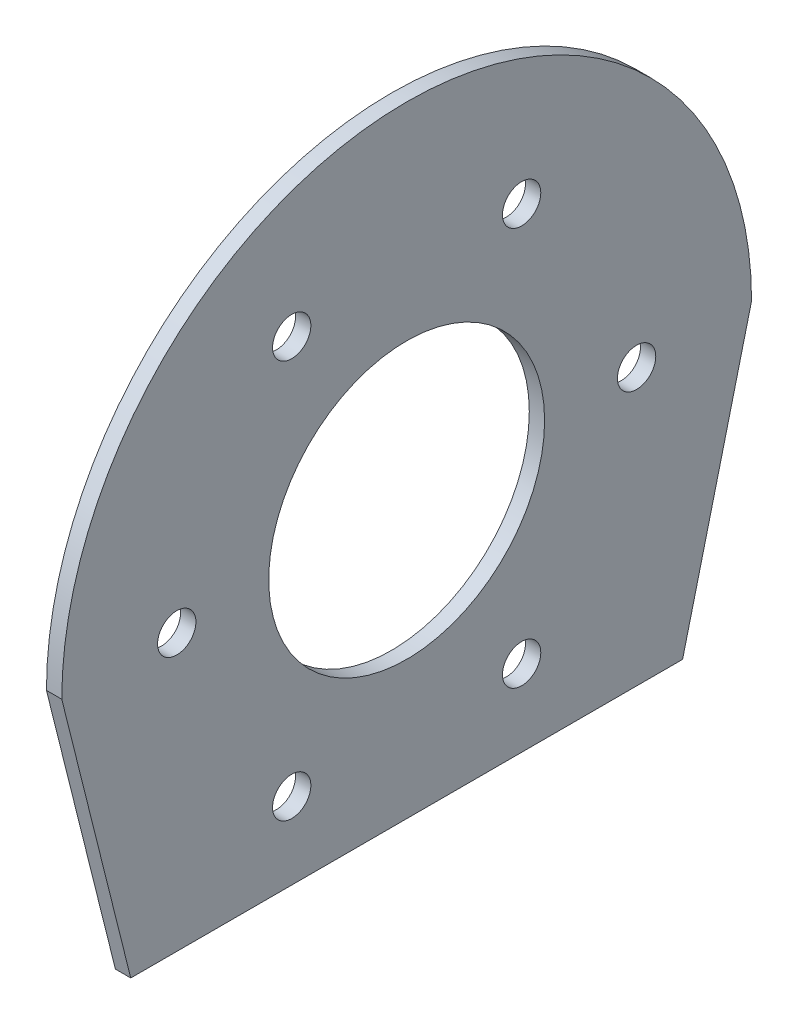
ISO-10303-21;
HEADER;
FILE_DESCRIPTION(('STEP AP214'),'2;1');
FILE_NAME('part.step','',(''),(''),'','','');
FILE_SCHEMA(('AUTOMOTIVE_DESIGN { 1 0 10303 214 1 1 1 1 }'));
ENDSEC;
DATA;
#1=APPLICATION_CONTEXT('core data for automotive mechanical design processes');
#2=APPLICATION_PROTOCOL_DEFINITION('international standard','automotive_design',2000,#1);
#3=PRODUCT_CONTEXT('',#1,'mechanical');
#4=PRODUCT('Part','Part','',(#3));
#5=PRODUCT_RELATED_PRODUCT_CATEGORY('part','',(#4));
#6=PRODUCT_DEFINITION_FORMATION('','',#4);
#7=PRODUCT_DEFINITION_CONTEXT('part definition',#1,'design');
#8=PRODUCT_DEFINITION('design','',#6,#7);
#9=PRODUCT_DEFINITION_SHAPE('','',#8);
#10=(LENGTH_UNIT() NAMED_UNIT(*) SI_UNIT(.MILLI.,.METRE.));
#11=(NAMED_UNIT(*) PLANE_ANGLE_UNIT() SI_UNIT($,.RADIAN.));
#12=(NAMED_UNIT(*) SI_UNIT($,.STERADIAN.) SOLID_ANGLE_UNIT());
#13=UNCERTAINTY_MEASURE_WITH_UNIT(LENGTH_MEASURE(1.E-05),#10,'distance_accuracy_value','');
#14=(GEOMETRIC_REPRESENTATION_CONTEXT(3) GLOBAL_UNCERTAINTY_ASSIGNED_CONTEXT((#13)) GLOBAL_UNIT_ASSIGNED_CONTEXT((#10,
#11,#12)) REPRESENTATION_CONTEXT('',''));
#15=CARTESIAN_POINT('',(0.,0.,0.));
#16=DIRECTION('',(0.,0.,1.));
#17=DIRECTION('',(1.,0.,0.));
#18=AXIS2_PLACEMENT_3D('',#15,#16,#17);
#19=CARTESIAN_POINT('',(0.5,0.,0.));
#20=DIRECTION('',(-1.,0.,0.));
#21=DIRECTION('',(0.,0.,1.));
#22=AXIS2_PLACEMENT_3D('',#19,#20,#21);
#23=PLANE('',#22);
#24=CARTESIAN_POINT('',(0.5,0.,-15.));
#25=DIRECTION('',(1.,0.,0.));
#26=DIRECTION('',(0.,0.,-1.));
#27=AXIS2_PLACEMENT_3D('',#24,#25,#26);
#28=CIRCLE('',#27,1.25);
#29=CARTESIAN_POINT('',(0.5,0.,-16.25));
#30=VERTEX_POINT('',#29);
#31=EDGE_CURVE('E140',#30,#30,#28,.T.);
#32=ORIENTED_EDGE('',*,*,#31,.F.);
#33=EDGE_LOOP('',(#32));
#34=FACE_BOUND('',#33,.T.);
#35=CARTESIAN_POINT('',(0.5,12.9903810567666,-7.49999999999999));
#36=DIRECTION('',(1.,0.,0.));
#37=DIRECTION('',(0.,0.,-1.));
#38=AXIS2_PLACEMENT_3D('',#35,#36,#37);
#39=CIRCLE('',#38,1.25);
#40=CARTESIAN_POINT('',(0.5,12.9903810567666,-8.74999999999999));
#41=VERTEX_POINT('',#40);
#42=EDGE_CURVE('E145',#41,#41,#39,.T.);
#43=ORIENTED_EDGE('',*,*,#42,.F.);
#44=EDGE_LOOP('',(#43));
#45=FACE_BOUND('',#44,.T.);
#46=CARTESIAN_POINT('',(0.5,12.9903810567666,7.50000000000001));
#47=DIRECTION('',(1.,0.,0.));
#48=DIRECTION('',(0.,0.,-1.));
#49=AXIS2_PLACEMENT_3D('',#46,#47,#48);
#50=CIRCLE('',#49,1.25);
#51=CARTESIAN_POINT('',(0.5,12.9903810567666,6.25000000000001));
#52=VERTEX_POINT('',#51);
#53=EDGE_CURVE('E121',#52,#52,#50,.T.);
#54=ORIENTED_EDGE('',*,*,#53,.F.);
#55=EDGE_LOOP('',(#54));
#56=FACE_BOUND('',#55,.T.);
#57=CARTESIAN_POINT('',(0.5,0.,15.));
#58=DIRECTION('',(1.,0.,0.));
#59=DIRECTION('',(0.,0.,-1.));
#60=AXIS2_PLACEMENT_3D('',#57,#58,#59);
#61=CIRCLE('',#60,1.25);
#62=CARTESIAN_POINT('',(0.5,0.,13.75));
#63=VERTEX_POINT('',#62);
#64=EDGE_CURVE('E120',#63,#63,#61,.T.);
#65=ORIENTED_EDGE('',*,*,#64,.F.);
#66=EDGE_LOOP('',(#65));
#67=FACE_BOUND('',#66,.T.);
#68=CARTESIAN_POINT('',(0.5,-12.9903810567666,7.5));
#69=DIRECTION('',(1.,0.,0.));
#70=DIRECTION('',(0.,0.,-1.));
#71=AXIS2_PLACEMENT_3D('',#68,#69,#70);
#72=CIRCLE('',#71,1.25);
#73=CARTESIAN_POINT('',(0.5,-12.9903810567666,6.24999999999999));
#74=VERTEX_POINT('',#73);
#75=EDGE_CURVE('E128',#74,#74,#72,.T.);
#76=ORIENTED_EDGE('',*,*,#75,.F.);
#77=EDGE_LOOP('',(#76));
#78=FACE_BOUND('',#77,.T.);
#79=CARTESIAN_POINT('',(0.5,-12.9903810567666,-7.5));
#80=DIRECTION('',(1.,0.,0.));
#81=DIRECTION('',(0.,0.,-1.));
#82=AXIS2_PLACEMENT_3D('',#79,#80,#81);
#83=CIRCLE('',#82,1.25);
#84=CARTESIAN_POINT('',(0.5,-12.9903810567666,-8.75));
#85=VERTEX_POINT('',#84);
#86=EDGE_CURVE('E134',#85,#85,#83,.T.);
#87=ORIENTED_EDGE('',*,*,#86,.F.);
#88=EDGE_LOOP('',(#87));
#89=FACE_BOUND('',#88,.T.);
#90=CARTESIAN_POINT('',(0.5,0.,0.));
#91=DIRECTION('',(1.,0.,0.));
#92=DIRECTION('',(0.,0.,1.));
#93=AXIS2_PLACEMENT_3D('',#90,#91,#92);
#94=CIRCLE('',#93,22.5);
#95=CARTESIAN_POINT('',(0.5,0.,-22.5));
#96=VERTEX_POINT('',#95);
#97=CARTESIAN_POINT('',(0.5,0.,22.5));
#98=VERTEX_POINT('',#97);
#99=EDGE_CURVE('E84',#96,#98,#94,.T.);
#100=ORIENTED_EDGE('',*,*,#99,.T.);
#101=DIRECTION('',(0.,-0.970142500145332,-0.242535625036333));
#102=VECTOR('',#101,1.);
#103=CARTESIAN_POINT('',(0.5,-18.,18.));
#104=LINE('',#103,#102);
#105=CARTESIAN_POINT('',(0.5,-18.,18.));
#106=VERTEX_POINT('',#105);
#107=EDGE_CURVE('E79',#98,#106,#104,.T.);
#108=ORIENTED_EDGE('',*,*,#107,.T.);
#109=DIRECTION('',(0.,0.,-1.));
#110=VECTOR('',#109,1.);
#111=CARTESIAN_POINT('',(0.5,-18.,18.));
#112=LINE('',#111,#110);
#113=CARTESIAN_POINT('',(0.5,-18.,-18.));
#114=VERTEX_POINT('',#113);
#115=EDGE_CURVE('E82',#106,#114,#112,.T.);
#116=ORIENTED_EDGE('',*,*,#115,.T.);
#117=DIRECTION('',(0.,0.970142500145332,-0.242535625036333));
#118=VECTOR('',#117,1.);
#119=CARTESIAN_POINT('',(0.5,-18.,-18.));
#120=LINE('',#119,#118);
#121=EDGE_CURVE('E49',#114,#96,#120,.T.);
#122=ORIENTED_EDGE('',*,*,#121,.T.);
#123=EDGE_LOOP('',(#100,#108,#116,#122));
#124=FACE_BOUND('',#123,.T.);
#125=CARTESIAN_POINT('',(0.5,0.,0.));
#126=DIRECTION('',(1.,0.,0.));
#127=DIRECTION('',(0.,0.,-1.));
#128=AXIS2_PLACEMENT_3D('',#125,#126,#127);
#129=CIRCLE('',#128,9.);
#130=CARTESIAN_POINT('',(0.5,0.,-9.));
#131=VERTEX_POINT('',#130);
#132=EDGE_CURVE('E99',#131,#131,#129,.T.);
#133=ORIENTED_EDGE('',*,*,#132,.F.);
#134=EDGE_LOOP('',(#133));
#135=FACE_BOUND('',#134,.T.);
#136=ADVANCED_FACE('F32',(#34,#45,#56,#67,#78,#89,#124,#135),#23,.F.);
#137=CARTESIAN_POINT('',(-0.5,0.,0.));
#138=DIRECTION('',(-1.,0.,0.));
#139=DIRECTION('',(0.,0.,1.));
#140=AXIS2_PLACEMENT_3D('',#137,#138,#139);
#141=PLANE('',#140);
#142=CARTESIAN_POINT('',(-0.5,0.,-15.));
#143=DIRECTION('',(-1.,0.,0.));
#144=DIRECTION('',(0.,0.,1.));
#145=AXIS2_PLACEMENT_3D('',#142,#143,#144);
#146=CIRCLE('',#145,1.25);
#147=CARTESIAN_POINT('',(-0.5,0.,-13.75));
#148=VERTEX_POINT('',#147);
#149=EDGE_CURVE('E114',#148,#148,#146,.F.);
#150=ORIENTED_EDGE('',*,*,#149,.T.);
#151=EDGE_LOOP('',(#150));
#152=FACE_BOUND('',#151,.T.);
#153=CARTESIAN_POINT('',(-0.5,12.9903810567666,-7.49999999999999));
#154=DIRECTION('',(-1.,0.,0.));
#155=DIRECTION('',(0.,0.,1.));
#156=AXIS2_PLACEMENT_3D('',#153,#154,#155);
#157=CIRCLE('',#156,1.25);
#158=CARTESIAN_POINT('',(-0.5,12.9903810567666,-6.24999999999999));
#159=VERTEX_POINT('',#158);
#160=EDGE_CURVE('E124',#159,#159,#157,.F.);
#161=ORIENTED_EDGE('',*,*,#160,.T.);
#162=EDGE_LOOP('',(#161));
#163=FACE_BOUND('',#162,.T.);
#164=CARTESIAN_POINT('',(-0.5,12.9903810567666,7.50000000000001));
#165=DIRECTION('',(-1.,0.,0.));
#166=DIRECTION('',(0.,0.,1.));
#167=AXIS2_PLACEMENT_3D('',#164,#165,#166);
#168=CIRCLE('',#167,1.25);
#169=CARTESIAN_POINT('',(-0.5,12.9903810567666,8.75000000000001));
#170=VERTEX_POINT('',#169);
#171=EDGE_CURVE('E117',#170,#170,#168,.F.);
#172=ORIENTED_EDGE('',*,*,#171,.T.);
#173=EDGE_LOOP('',(#172));
#174=FACE_BOUND('',#173,.T.);
#175=CARTESIAN_POINT('',(-0.5,0.,15.));
#176=DIRECTION('',(-1.,0.,0.));
#177=DIRECTION('',(0.,0.,1.));
#178=AXIS2_PLACEMENT_3D('',#175,#176,#177);
#179=CIRCLE('',#178,1.25);
#180=CARTESIAN_POINT('',(-0.5,0.,16.25));
#181=VERTEX_POINT('',#180);
#182=EDGE_CURVE('E125',#181,#181,#179,.F.);
#183=ORIENTED_EDGE('',*,*,#182,.T.);
#184=EDGE_LOOP('',(#183));
#185=FACE_BOUND('',#184,.T.);
#186=CARTESIAN_POINT('',(-0.5,-12.9903810567666,7.5));
#187=DIRECTION('',(-1.,0.,0.));
#188=DIRECTION('',(0.,0.,1.));
#189=AXIS2_PLACEMENT_3D('',#186,#187,#188);
#190=CIRCLE('',#189,1.25);
#191=CARTESIAN_POINT('',(-0.5,-12.9903810567666,8.75));
#192=VERTEX_POINT('',#191);
#193=EDGE_CURVE('E131',#192,#192,#190,.F.);
#194=ORIENTED_EDGE('',*,*,#193,.T.);
#195=EDGE_LOOP('',(#194));
#196=FACE_BOUND('',#195,.T.);
#197=CARTESIAN_POINT('',(-0.5,-12.9903810567666,-7.5));
#198=DIRECTION('',(-1.,0.,0.));
#199=DIRECTION('',(0.,0.,1.));
#200=AXIS2_PLACEMENT_3D('',#197,#198,#199);
#201=CIRCLE('',#200,1.25);
#202=CARTESIAN_POINT('',(-0.5,-12.9903810567666,-6.25));
#203=VERTEX_POINT('',#202);
#204=EDGE_CURVE('E137',#203,#203,#201,.F.);
#205=ORIENTED_EDGE('',*,*,#204,.T.);
#206=EDGE_LOOP('',(#205));
#207=FACE_BOUND('',#206,.T.);
#208=CARTESIAN_POINT('',(-0.5,0.,0.));
#209=DIRECTION('',(1.,0.,0.));
#210=DIRECTION('',(0.,0.,1.));
#211=AXIS2_PLACEMENT_3D('',#208,#209,#210);
#212=CIRCLE('',#211,22.5);
#213=CARTESIAN_POINT('',(-0.5,0.,-22.5));
#214=VERTEX_POINT('',#213);
#215=CARTESIAN_POINT('',(-0.5,0.,22.5));
#216=VERTEX_POINT('',#215);
#217=EDGE_CURVE('E96',#214,#216,#212,.T.);
#218=ORIENTED_EDGE('',*,*,#217,.F.);
#219=DIRECTION('',(0.,0.970142500145332,-0.242535625036333));
#220=VECTOR('',#219,1.);
#221=CARTESIAN_POINT('',(-0.5,-18.,-18.));
#222=LINE('',#221,#220);
#223=CARTESIAN_POINT('',(-0.5,-18.,-18.));
#224=VERTEX_POINT('',#223);
#225=EDGE_CURVE('E72',#224,#214,#222,.T.);
#226=ORIENTED_EDGE('',*,*,#225,.F.);
#227=DIRECTION('',(0.,0.,-1.));
#228=VECTOR('',#227,1.);
#229=CARTESIAN_POINT('',(-0.5,-18.,18.));
#230=LINE('',#229,#228);
#231=CARTESIAN_POINT('',(-0.5,-18.,18.));
#232=VERTEX_POINT('',#231);
#233=EDGE_CURVE('E66',#232,#224,#230,.T.);
#234=ORIENTED_EDGE('',*,*,#233,.F.);
#235=DIRECTION('',(0.,-0.970142500145332,-0.242535625036333));
#236=VECTOR('',#235,1.);
#237=CARTESIAN_POINT('',(-0.5,-18.,18.));
#238=LINE('',#237,#236);
#239=EDGE_CURVE('E88',#216,#232,#238,.T.);
#240=ORIENTED_EDGE('',*,*,#239,.F.);
#241=EDGE_LOOP('',(#218,#226,#234,#240));
#242=FACE_BOUND('',#241,.T.);
#243=CARTESIAN_POINT('',(-0.5,0.,0.));
#244=DIRECTION('',(1.,0.,0.));
#245=DIRECTION('',(0.,0.,-1.));
#246=AXIS2_PLACEMENT_3D('',#243,#244,#245);
#247=CIRCLE('',#246,9.);
#248=CARTESIAN_POINT('',(-0.5,0.,-9.));
#249=VERTEX_POINT('',#248);
#250=EDGE_CURVE('E111',#249,#249,#247,.T.);
#251=ORIENTED_EDGE('',*,*,#250,.T.);
#252=EDGE_LOOP('',(#251));
#253=FACE_BOUND('',#252,.T.);
#254=ADVANCED_FACE('F107',(#152,#163,#174,#185,#196,#207,#242,#253),#141,.T.);
#255=CARTESIAN_POINT('',(0.5,0.,0.));
#256=DIRECTION('',(-1.,0.,0.));
#257=DIRECTION('',(0.,0.,1.));
#258=AXIS2_PLACEMENT_3D('',#255,#256,#257);
#259=CYLINDRICAL_SURFACE('',#258,22.5);
#260=ORIENTED_EDGE('',*,*,#217,.T.);
#261=DIRECTION('',(-1.,0.,0.));
#262=VECTOR('',#261,1.);
#263=CARTESIAN_POINT('',(0.5,0.,22.5));
#264=LINE('',#263,#262);
#265=EDGE_CURVE('E11',#98,#216,#264,.T.);
#266=ORIENTED_EDGE('',*,*,#265,.F.);
#267=ORIENTED_EDGE('',*,*,#99,.F.);
#268=DIRECTION('',(-1.,0.,0.));
#269=VECTOR('',#268,1.);
#270=CARTESIAN_POINT('',(0.5,0.,-22.5));
#271=LINE('',#270,#269);
#272=EDGE_CURVE('E92',#96,#214,#271,.T.);
#273=ORIENTED_EDGE('',*,*,#272,.T.);
#274=EDGE_LOOP('',(#260,#266,#267,#273));
#275=FACE_BOUND('',#274,.T.);
#276=ADVANCED_FACE('F34',(#275),#259,.T.);
#277=CARTESIAN_POINT('',(0.5,-18.,18.));
#278=DIRECTION('',(0.,0.242535625036333,-0.970142500145332));
#279=DIRECTION('',(0.,0.970142500145332,0.242535625036333));
#280=AXIS2_PLACEMENT_3D('',#277,#278,#279);
#281=PLANE('',#280);
#282=ORIENTED_EDGE('',*,*,#239,.T.);
#283=DIRECTION('',(-1.,0.,0.));
#284=VECTOR('',#283,1.);
#285=CARTESIAN_POINT('',(0.5,-18.,18.));
#286=LINE('',#285,#284);
#287=EDGE_CURVE('E41',#106,#232,#286,.T.);
#288=ORIENTED_EDGE('',*,*,#287,.F.);
#289=ORIENTED_EDGE('',*,*,#107,.F.);
#290=ORIENTED_EDGE('',*,*,#265,.T.);
#291=EDGE_LOOP('',(#282,#288,#289,#290));
#292=FACE_BOUND('',#291,.T.);
#293=ADVANCED_FACE('F87',(#292),#281,.F.);
#294=CARTESIAN_POINT('',(0.5,-18.,18.));
#295=DIRECTION('',(0.,1.,0.));
#296=DIRECTION('',(0.,0.,1.));
#297=AXIS2_PLACEMENT_3D('',#294,#295,#296);
#298=PLANE('',#297);
#299=ORIENTED_EDGE('',*,*,#233,.T.);
#300=DIRECTION('',(-1.,0.,0.));
#301=VECTOR('',#300,1.);
#302=CARTESIAN_POINT('',(0.5,-18.,-18.));
#303=LINE('',#302,#301);
#304=EDGE_CURVE('E89',#114,#224,#303,.T.);
#305=ORIENTED_EDGE('',*,*,#304,.F.);
#306=ORIENTED_EDGE('',*,*,#115,.F.);
#307=ORIENTED_EDGE('',*,*,#287,.T.);
#308=EDGE_LOOP('',(#299,#305,#306,#307));
#309=FACE_BOUND('',#308,.T.);
#310=ADVANCED_FACE('F90',(#309),#298,.F.);
#311=CARTESIAN_POINT('',(0.5,-18.,-18.));
#312=DIRECTION('',(0.,0.242535625036333,0.970142500145332));
#313=DIRECTION('',(0.,-0.970142500145332,0.242535625036333));
#314=AXIS2_PLACEMENT_3D('',#311,#312,#313);
#315=PLANE('',#314);
#316=ORIENTED_EDGE('',*,*,#225,.T.);
#317=ORIENTED_EDGE('',*,*,#272,.F.);
#318=ORIENTED_EDGE('',*,*,#121,.F.);
#319=ORIENTED_EDGE('',*,*,#304,.T.);
#320=EDGE_LOOP('',(#316,#317,#318,#319));
#321=FACE_BOUND('',#320,.T.);
#322=ADVANCED_FACE('F104',(#321),#315,.F.);
#323=CARTESIAN_POINT('',(0.5,0.,0.));
#324=DIRECTION('',(-1.,0.,0.));
#325=DIRECTION('',(0.,0.,1.));
#326=AXIS2_PLACEMENT_3D('',#323,#324,#325);
#327=CYLINDRICAL_SURFACE('',#326,9.);
#328=ORIENTED_EDGE('',*,*,#132,.T.);
#329=EDGE_LOOP('',(#328));
#330=FACE_BOUND('',#329,.T.);
#331=ORIENTED_EDGE('',*,*,#250,.F.);
#332=EDGE_LOOP('',(#331));
#333=FACE_BOUND('',#332,.T.);
#334=ADVANCED_FACE('F173',(#330,#333),#327,.F.);
#335=CARTESIAN_POINT('',(-4.03553390593275,-12.9903810567666,-7.5));
#336=DIRECTION('',(1.,0.,0.));
#337=DIRECTION('',(0.,0.,-1.));
#338=AXIS2_PLACEMENT_3D('',#335,#336,#337);
#339=CYLINDRICAL_SURFACE('',#338,1.25);
#340=ORIENTED_EDGE('',*,*,#86,.T.);
#341=EDGE_LOOP('',(#340));
#342=FACE_BOUND('',#341,.T.);
#343=ORIENTED_EDGE('',*,*,#204,.F.);
#344=EDGE_LOOP('',(#343));
#345=FACE_BOUND('',#344,.T.);
#346=ADVANCED_FACE('F169',(#342,#345),#339,.F.);
#347=CARTESIAN_POINT('',(-4.03553390593275,-12.9903810567666,7.5));
#348=DIRECTION('',(1.,0.,0.));
#349=DIRECTION('',(0.,0.,-1.));
#350=AXIS2_PLACEMENT_3D('',#347,#348,#349);
#351=CYLINDRICAL_SURFACE('',#350,1.25);
#352=ORIENTED_EDGE('',*,*,#75,.T.);
#353=EDGE_LOOP('',(#352));
#354=FACE_BOUND('',#353,.T.);
#355=ORIENTED_EDGE('',*,*,#193,.F.);
#356=EDGE_LOOP('',(#355));
#357=FACE_BOUND('',#356,.T.);
#358=ADVANCED_FACE('F172',(#354,#357),#351,.F.);
#359=CARTESIAN_POINT('',(-4.03553390593275,0.,15.));
#360=DIRECTION('',(1.,0.,0.));
#361=DIRECTION('',(0.,0.,-1.));
#362=AXIS2_PLACEMENT_3D('',#359,#360,#361);
#363=CYLINDRICAL_SURFACE('',#362,1.25);
#364=ORIENTED_EDGE('',*,*,#64,.T.);
#365=EDGE_LOOP('',(#364));
#366=FACE_BOUND('',#365,.T.);
#367=ORIENTED_EDGE('',*,*,#182,.F.);
#368=EDGE_LOOP('',(#367));
#369=FACE_BOUND('',#368,.T.);
#370=ADVANCED_FACE('F219',(#366,#369),#363,.F.);
#371=CARTESIAN_POINT('',(-4.03553390593275,12.9903810567666,7.50000000000001));
#372=DIRECTION('',(1.,0.,0.));
#373=DIRECTION('',(0.,0.,-1.));
#374=AXIS2_PLACEMENT_3D('',#371,#372,#373);
#375=CYLINDRICAL_SURFACE('',#374,1.25);
#376=ORIENTED_EDGE('',*,*,#53,.T.);
#377=EDGE_LOOP('',(#376));
#378=FACE_BOUND('',#377,.T.);
#379=ORIENTED_EDGE('',*,*,#171,.F.);
#380=EDGE_LOOP('',(#379));
#381=FACE_BOUND('',#380,.T.);
#382=ADVANCED_FACE('F227',(#378,#381),#375,.F.);
#383=CARTESIAN_POINT('',(-4.03553390593275,12.9903810567666,-7.49999999999999));
#384=DIRECTION('',(1.,0.,0.));
#385=DIRECTION('',(0.,0.,-1.));
#386=AXIS2_PLACEMENT_3D('',#383,#384,#385);
#387=CYLINDRICAL_SURFACE('',#386,1.25);
#388=ORIENTED_EDGE('',*,*,#42,.T.);
#389=EDGE_LOOP('',(#388));
#390=FACE_BOUND('',#389,.T.);
#391=ORIENTED_EDGE('',*,*,#160,.F.);
#392=EDGE_LOOP('',(#391));
#393=FACE_BOUND('',#392,.T.);
#394=ADVANCED_FACE('F235',(#390,#393),#387,.F.);
#395=CARTESIAN_POINT('',(-4.03553390593275,0.,-15.));
#396=DIRECTION('',(1.,0.,0.));
#397=DIRECTION('',(0.,0.,-1.));
#398=AXIS2_PLACEMENT_3D('',#395,#396,#397);
#399=CYLINDRICAL_SURFACE('',#398,1.25);
#400=ORIENTED_EDGE('',*,*,#31,.T.);
#401=EDGE_LOOP('',(#400));
#402=FACE_BOUND('',#401,.T.);
#403=ORIENTED_EDGE('',*,*,#149,.F.);
#404=EDGE_LOOP('',(#403));
#405=FACE_BOUND('',#404,.T.);
#406=ADVANCED_FACE('F153',(#402,#405),#399,.F.);
#407=CLOSED_SHELL('',(#136,#254,#276,#293,#310,#322,#334,#346,#358,#370,#382,#394,#406));
#408=MANIFOLD_SOLID_BREP('B2',#407);
#409=ADVANCED_BREP_SHAPE_REPRESENTATION('',(#18,#408),#14);
#410=SHAPE_DEFINITION_REPRESENTATION(#9,#409);
ENDSEC;
END-ISO-10303-21;
